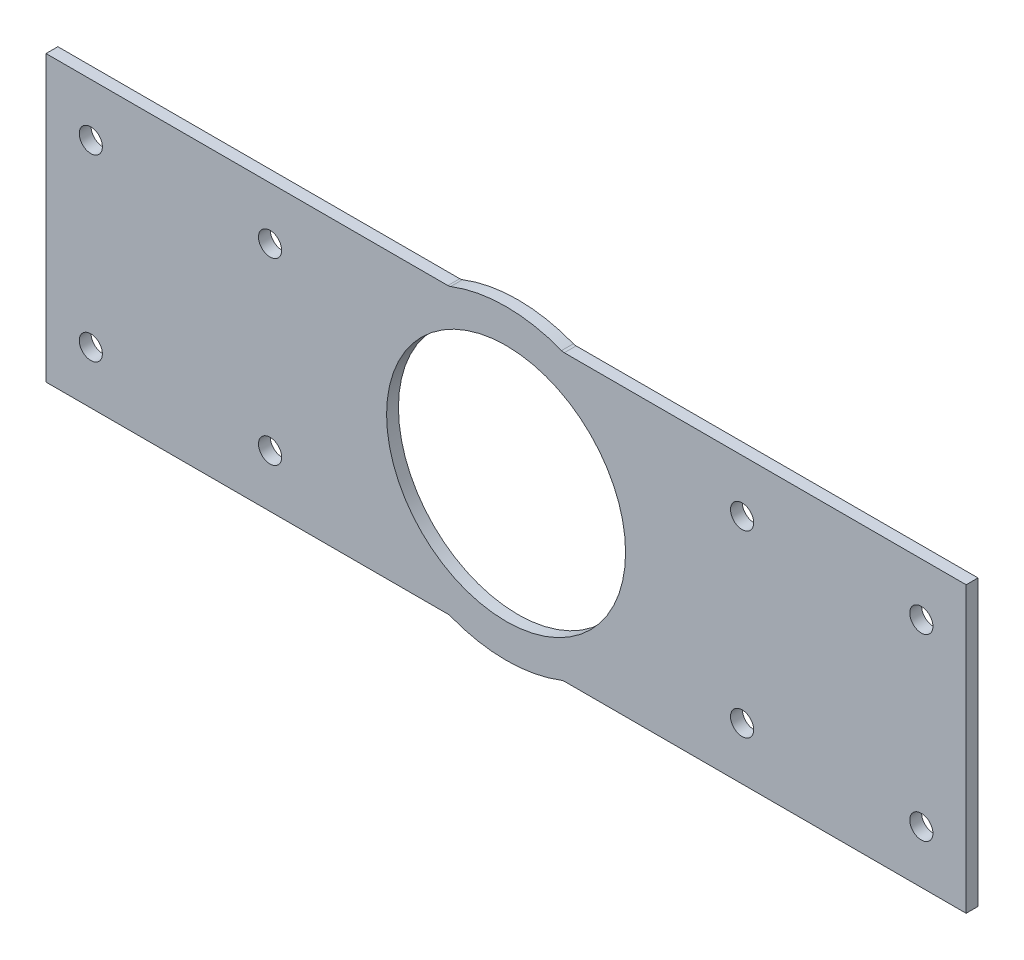
ISO-10303-21;
HEADER;
FILE_DESCRIPTION(('STEP AP214'),'2;1');
FILE_NAME('part.step','',(''),(''),'','','');
FILE_SCHEMA(('AUTOMOTIVE_DESIGN { 1 0 10303 214 1 1 1 1 }'));
ENDSEC;
DATA;
#1=APPLICATION_CONTEXT('core data for automotive mechanical design processes');
#2=APPLICATION_PROTOCOL_DEFINITION('international standard','automotive_design',2000,#1);
#3=PRODUCT_CONTEXT('',#1,'mechanical');
#4=PRODUCT('Part','Part','',(#3));
#5=PRODUCT_RELATED_PRODUCT_CATEGORY('part','',(#4));
#6=PRODUCT_DEFINITION_FORMATION('','',#4);
#7=PRODUCT_DEFINITION_CONTEXT('part definition',#1,'design');
#8=PRODUCT_DEFINITION('design','',#6,#7);
#9=PRODUCT_DEFINITION_SHAPE('','',#8);
#10=(LENGTH_UNIT() NAMED_UNIT(*) SI_UNIT(.MILLI.,.METRE.));
#11=(NAMED_UNIT(*) PLANE_ANGLE_UNIT() SI_UNIT($,.RADIAN.));
#12=(NAMED_UNIT(*) SI_UNIT($,.STERADIAN.) SOLID_ANGLE_UNIT());
#13=UNCERTAINTY_MEASURE_WITH_UNIT(LENGTH_MEASURE(1.E-05),#10,'distance_accuracy_value','');
#14=(GEOMETRIC_REPRESENTATION_CONTEXT(3) GLOBAL_UNCERTAINTY_ASSIGNED_CONTEXT((#13)) GLOBAL_UNIT_ASSIGNED_CONTEXT((#10,
#11,#12)) REPRESENTATION_CONTEXT('',''));
#15=CARTESIAN_POINT('',(0.,0.,0.));
#16=DIRECTION('',(0.,0.,1.));
#17=DIRECTION('',(1.,0.,0.));
#18=AXIS2_PLACEMENT_3D('',#15,#16,#17);
#19=CARTESIAN_POINT('',(0.,0.,1.5875));
#20=DIRECTION('',(0.,0.,-1.));
#21=DIRECTION('',(-1.,0.,0.));
#22=AXIS2_PLACEMENT_3D('',#19,#20,#21);
#23=PLANE('',#22);
#24=CARTESIAN_POINT('',(0.,0.,1.5875));
#25=DIRECTION('',(0.,0.,1.));
#26=DIRECTION('',(1.,0.,0.));
#27=AXIS2_PLACEMENT_3D('',#24,#25,#26);
#28=CIRCLE('',#27,32.);
#29=CARTESIAN_POINT('',(32.,0.,1.5875));
#30=VERTEX_POINT('',#29);
#31=EDGE_CURVE('E607',#30,#30,#28,.T.);
#32=ORIENTED_EDGE('',*,*,#31,.F.);
#33=EDGE_LOOP('',(#32));
#34=FACE_BOUND('',#33,.T.);
#35=CARTESIAN_POINT('',(63.2023827408732,24.,1.5875));
#36=DIRECTION('',(0.,0.,-1.));
#37=DIRECTION('',(-1.,0.,0.));
#38=AXIS2_PLACEMENT_3D('',#35,#36,#37);
#39=CIRCLE('',#38,3.09999999999999);
#40=CARTESIAN_POINT('',(60.1023827408732,24.,1.5875));
#41=VERTEX_POINT('',#40);
#42=EDGE_CURVE('E600',#41,#41,#39,.T.);
#43=ORIENTED_EDGE('',*,*,#42,.T.);
#44=EDGE_LOOP('',(#43));
#45=FACE_BOUND('',#44,.T.);
#46=CARTESIAN_POINT('',(111.202382740873,24.,1.5875));
#47=DIRECTION('',(0.,0.,1.));
#48=DIRECTION('',(1.,0.,0.));
#49=AXIS2_PLACEMENT_3D('',#46,#47,#48);
#50=CIRCLE('',#49,3.1);
#51=CARTESIAN_POINT('',(114.302382740873,24.,1.5875));
#52=VERTEX_POINT('',#51);
#53=EDGE_CURVE('E572',#52,#52,#50,.F.);
#54=ORIENTED_EDGE('',*,*,#53,.T.);
#55=EDGE_LOOP('',(#54));
#56=FACE_BOUND('',#55,.T.);
#57=CARTESIAN_POINT('',(111.202382740873,-24.,1.5875));
#58=DIRECTION('',(0.,0.,1.));
#59=DIRECTION('',(1.,0.,0.));
#60=AXIS2_PLACEMENT_3D('',#57,#58,#59);
#61=CIRCLE('',#60,3.1);
#62=CARTESIAN_POINT('',(114.302382740873,-24.,1.5875));
#63=VERTEX_POINT('',#62);
#64=EDGE_CURVE('E566',#63,#63,#61,.F.);
#65=ORIENTED_EDGE('',*,*,#64,.T.);
#66=EDGE_LOOP('',(#65));
#67=FACE_BOUND('',#66,.T.);
#68=CARTESIAN_POINT('',(63.2023827408733,-24.,1.5875));
#69=DIRECTION('',(0.,0.,1.));
#70=DIRECTION('',(1.,0.,0.));
#71=AXIS2_PLACEMENT_3D('',#68,#69,#70);
#72=CIRCLE('',#71,3.1);
#73=CARTESIAN_POINT('',(66.3023827408733,-24.,1.5875));
#74=VERTEX_POINT('',#73);
#75=EDGE_CURVE('E559',#74,#74,#72,.F.);
#76=ORIENTED_EDGE('',*,*,#75,.T.);
#77=EDGE_LOOP('',(#76));
#78=FACE_BOUND('',#77,.T.);
#79=CARTESIAN_POINT('',(0.,0.,1.5875));
#80=DIRECTION('',(0.,0.,-1.));
#81=DIRECTION('',(-1.,0.,0.));
#82=AXIS2_PLACEMENT_3D('',#79,#80,#81);
#83=CIRCLE('',#82,41.021);
#84=CARTESIAN_POINT('',(-14.8575397339142,38.2357941470445,1.5875));
#85=VERTEX_POINT('',#84);
#86=CARTESIAN_POINT('',(14.8575397339142,38.2357941470445,1.5875));
#87=VERTEX_POINT('',#86);
#88=EDGE_CURVE('E132',#85,#87,#83,.T.);
#89=ORIENTED_EDGE('',*,*,#88,.F.);
#90=CARTESIAN_POINT('',(-15.5819267422229,40.1,1.5875));
#91=DIRECTION('',(0.,0.,-1.));
#92=DIRECTION('',(-1.,0.,0.));
#93=AXIS2_PLACEMENT_3D('',#90,#91,#92);
#94=CIRCLE('',#93,2.);
#95=CARTESIAN_POINT('',(-15.5819267422229,38.1,1.5875));
#96=VERTEX_POINT('',#95);
#97=EDGE_CURVE('E216',#85,#96,#94,.T.);
#98=ORIENTED_EDGE('',*,*,#97,.T.);
#99=DIRECTION('',(-1.,0.,0.));
#100=VECTOR('',#99,1.);
#101=CARTESIAN_POINT('',(-15.2023827408732,38.1,1.5875));
#102=LINE('',#101,#100);
#103=CARTESIAN_POINT('',(-123.202382740873,38.1,1.5875));
#104=VERTEX_POINT('',#103);
#105=EDGE_CURVE('E142',#96,#104,#102,.T.);
#106=ORIENTED_EDGE('',*,*,#105,.T.);
#107=DIRECTION('',(0.,-1.,0.));
#108=VECTOR('',#107,1.);
#109=CARTESIAN_POINT('',(-123.202382740873,38.1,1.5875));
#110=LINE('',#109,#108);
#111=CARTESIAN_POINT('',(-123.202382740873,-38.1,1.5875));
#112=VERTEX_POINT('',#111);
#113=EDGE_CURVE('E158',#104,#112,#110,.T.);
#114=ORIENTED_EDGE('',*,*,#113,.T.);
#115=DIRECTION('',(-1.,0.,0.));
#116=VECTOR('',#115,1.);
#117=CARTESIAN_POINT('',(-15.2023827408732,-38.1,1.5875));
#118=LINE('',#117,#116);
#119=CARTESIAN_POINT('',(-15.5819267422229,-38.1,1.5875));
#120=VERTEX_POINT('',#119);
#121=EDGE_CURVE('E156',#120,#112,#118,.T.);
#122=ORIENTED_EDGE('',*,*,#121,.F.);
#123=CARTESIAN_POINT('',(-15.5819267422229,-40.1,1.5875));
#124=DIRECTION('',(0.,0.,-1.));
#125=DIRECTION('',(-1.,0.,0.));
#126=AXIS2_PLACEMENT_3D('',#123,#124,#125);
#127=CIRCLE('',#126,2.);
#128=CARTESIAN_POINT('',(-14.8575397339142,-38.2357941470445,1.5875));
#129=VERTEX_POINT('',#128);
#130=EDGE_CURVE('E208',#120,#129,#127,.T.);
#131=ORIENTED_EDGE('',*,*,#130,.T.);
#132=CARTESIAN_POINT('',(0.,0.,1.5875));
#133=DIRECTION('',(0.,0.,1.));
#134=DIRECTION('',(1.,0.,0.));
#135=AXIS2_PLACEMENT_3D('',#132,#133,#134);
#136=CIRCLE('',#135,41.021);
#137=CARTESIAN_POINT('',(14.8575397339142,-38.2357941470445,1.5875));
#138=VERTEX_POINT('',#137);
#139=EDGE_CURVE('E147',#129,#138,#136,.T.);
#140=ORIENTED_EDGE('',*,*,#139,.T.);
#141=CARTESIAN_POINT('',(15.5819267422229,-40.1,1.5875));
#142=DIRECTION('',(0.,0.,-1.));
#143=DIRECTION('',(-1.,0.,0.));
#144=AXIS2_PLACEMENT_3D('',#141,#142,#143);
#145=CIRCLE('',#144,2.);
#146=CARTESIAN_POINT('',(15.5819267422229,-38.1,1.5875));
#147=VERTEX_POINT('',#146);
#148=EDGE_CURVE('E215',#138,#147,#145,.T.);
#149=ORIENTED_EDGE('',*,*,#148,.T.);
#150=DIRECTION('',(1.,0.,0.));
#151=VECTOR('',#150,1.);
#152=CARTESIAN_POINT('',(15.2023827408732,-38.1,1.5875));
#153=LINE('',#152,#151);
#154=CARTESIAN_POINT('',(123.202382740873,-38.1,1.5875));
#155=VERTEX_POINT('',#154);
#156=EDGE_CURVE('E150',#147,#155,#153,.T.);
#157=ORIENTED_EDGE('',*,*,#156,.T.);
#158=DIRECTION('',(0.,-1.,0.));
#159=VECTOR('',#158,1.);
#160=CARTESIAN_POINT('',(123.202382740873,38.1,1.5875));
#161=LINE('',#160,#159);
#162=CARTESIAN_POINT('',(123.202382740873,38.1,1.5875));
#163=VERTEX_POINT('',#162);
#164=EDGE_CURVE('E135',#163,#155,#161,.T.);
#165=ORIENTED_EDGE('',*,*,#164,.F.);
#166=DIRECTION('',(1.,0.,0.));
#167=VECTOR('',#166,1.);
#168=CARTESIAN_POINT('',(15.2023827408732,38.1,1.5875));
#169=LINE('',#168,#167);
#170=CARTESIAN_POINT('',(15.5819267422229,38.1,1.5875));
#171=VERTEX_POINT('',#170);
#172=EDGE_CURVE('E124',#171,#163,#169,.T.);
#173=ORIENTED_EDGE('',*,*,#172,.F.);
#174=CARTESIAN_POINT('',(15.5819267422229,40.1,1.5875));
#175=DIRECTION('',(0.,0.,-1.));
#176=DIRECTION('',(-1.,0.,0.));
#177=AXIS2_PLACEMENT_3D('',#174,#175,#176);
#178=CIRCLE('',#177,2.);
#179=EDGE_CURVE('E11',#171,#87,#178,.T.);
#180=ORIENTED_EDGE('',*,*,#179,.T.);
#181=EDGE_LOOP('',(#89,#98,#106,#114,#122,#131,#140,#149,#157,#165,#173,#180));
#182=FACE_BOUND('',#181,.T.);
#183=CARTESIAN_POINT('',(-63.2023827408732,24.,1.5875));
#184=DIRECTION('',(0.,0.,1.));
#185=DIRECTION('',(1.,0.,0.));
#186=AXIS2_PLACEMENT_3D('',#183,#184,#185);
#187=CIRCLE('',#186,3.09999999999999);
#188=CARTESIAN_POINT('',(-60.1023827408732,24.,1.5875));
#189=VERTEX_POINT('',#188);
#190=EDGE_CURVE('E164',#189,#189,#187,.T.);
#191=ORIENTED_EDGE('',*,*,#190,.F.);
#192=EDGE_LOOP('',(#191));
#193=FACE_BOUND('',#192,.T.);
#194=CARTESIAN_POINT('',(-63.2023827408733,-24.,1.5875));
#195=DIRECTION('',(0.,0.,1.));
#196=DIRECTION('',(1.,0.,0.));
#197=AXIS2_PLACEMENT_3D('',#194,#195,#196);
#198=CIRCLE('',#197,3.1);
#199=CARTESIAN_POINT('',(-60.1023827408732,-24.,1.5875));
#200=VERTEX_POINT('',#199);
#201=EDGE_CURVE('E579',#200,#200,#198,.T.);
#202=ORIENTED_EDGE('',*,*,#201,.F.);
#203=EDGE_LOOP('',(#202));
#204=FACE_BOUND('',#203,.T.);
#205=CARTESIAN_POINT('',(-111.202382740873,-24.,1.5875));
#206=DIRECTION('',(0.,0.,1.));
#207=DIRECTION('',(1.,0.,0.));
#208=AXIS2_PLACEMENT_3D('',#205,#206,#207);
#209=CIRCLE('',#208,3.1);
#210=CARTESIAN_POINT('',(-108.102382740873,-24.,1.5875));
#211=VERTEX_POINT('',#210);
#212=EDGE_CURVE('E584',#211,#211,#209,.T.);
#213=ORIENTED_EDGE('',*,*,#212,.F.);
#214=EDGE_LOOP('',(#213));
#215=FACE_BOUND('',#214,.T.);
#216=CARTESIAN_POINT('',(-111.202382740873,24.,1.5875));
#217=DIRECTION('',(0.,0.,1.));
#218=DIRECTION('',(1.,0.,0.));
#219=AXIS2_PLACEMENT_3D('',#216,#217,#218);
#220=CIRCLE('',#219,3.1);
#221=CARTESIAN_POINT('',(-108.102382740873,24.,1.5875));
#222=VERTEX_POINT('',#221);
#223=EDGE_CURVE('E591',#222,#222,#220,.T.);
#224=ORIENTED_EDGE('',*,*,#223,.F.);
#225=EDGE_LOOP('',(#224));
#226=FACE_BOUND('',#225,.T.);
#227=ADVANCED_FACE('F39',(#34,#45,#56,#67,#78,#182,#193,#204,#215,#226),#23,.F.);
#228=CARTESIAN_POINT('',(0.,0.,-1.5875));
#229=DIRECTION('',(0.,0.,-1.));
#230=DIRECTION('',(-1.,0.,0.));
#231=AXIS2_PLACEMENT_3D('',#228,#229,#230);
#232=PLANE('',#231);
#233=CARTESIAN_POINT('',(0.,0.,-1.5875));
#234=DIRECTION('',(0.,0.,1.));
#235=DIRECTION('',(1.,0.,0.));
#236=AXIS2_PLACEMENT_3D('',#233,#234,#235);
#237=CIRCLE('',#236,32.);
#238=CARTESIAN_POINT('',(32.,0.,-1.5875));
#239=VERTEX_POINT('',#238);
#240=EDGE_CURVE('E602',#239,#239,#237,.T.);
#241=ORIENTED_EDGE('',*,*,#240,.T.);
#242=EDGE_LOOP('',(#241));
#243=FACE_BOUND('',#242,.T.);
#244=CARTESIAN_POINT('',(63.2023827408732,24.,-1.5875));
#245=DIRECTION('',(0.,0.,-1.));
#246=DIRECTION('',(-1.,0.,0.));
#247=AXIS2_PLACEMENT_3D('',#244,#245,#246);
#248=CIRCLE('',#247,3.09999999999999);
#249=CARTESIAN_POINT('',(60.1023827408732,24.,-1.5875));
#250=VERTEX_POINT('',#249);
#251=EDGE_CURVE('E599',#250,#250,#248,.T.);
#252=ORIENTED_EDGE('',*,*,#251,.F.);
#253=EDGE_LOOP('',(#252));
#254=FACE_BOUND('',#253,.T.);
#255=CARTESIAN_POINT('',(-111.202382740873,-24.,-1.5875));
#256=DIRECTION('',(0.,0.,1.));
#257=DIRECTION('',(1.,0.,0.));
#258=AXIS2_PLACEMENT_3D('',#255,#256,#257);
#259=CIRCLE('',#258,3.1);
#260=CARTESIAN_POINT('',(-108.102382740873,-24.,-1.5875));
#261=VERTEX_POINT('',#260);
#262=EDGE_CURVE('E586',#261,#261,#259,.T.);
#263=ORIENTED_EDGE('',*,*,#262,.T.);
#264=EDGE_LOOP('',(#263));
#265=FACE_BOUND('',#264,.T.);
#266=CARTESIAN_POINT('',(-63.2023827408733,-24.,-1.5875));
#267=DIRECTION('',(0.,0.,1.));
#268=DIRECTION('',(1.,0.,0.));
#269=AXIS2_PLACEMENT_3D('',#266,#267,#268);
#270=CIRCLE('',#269,3.1);
#271=CARTESIAN_POINT('',(-60.1023827408732,-24.,-1.5875));
#272=VERTEX_POINT('',#271);
#273=EDGE_CURVE('E582',#272,#272,#270,.T.);
#274=ORIENTED_EDGE('',*,*,#273,.T.);
#275=EDGE_LOOP('',(#274));
#276=FACE_BOUND('',#275,.T.);
#277=CARTESIAN_POINT('',(111.202382740873,24.,-1.5875));
#278=DIRECTION('',(0.,0.,1.));
#279=DIRECTION('',(1.,0.,0.));
#280=AXIS2_PLACEMENT_3D('',#277,#278,#279);
#281=CIRCLE('',#280,3.1);
#282=CARTESIAN_POINT('',(114.302382740873,24.,-1.5875));
#283=VERTEX_POINT('',#282);
#284=EDGE_CURVE('E577',#283,#283,#281,.F.);
#285=ORIENTED_EDGE('',*,*,#284,.F.);
#286=EDGE_LOOP('',(#285));
#287=FACE_BOUND('',#286,.T.);
#288=CARTESIAN_POINT('',(111.202382740873,-24.,-1.5875));
#289=DIRECTION('',(0.,0.,1.));
#290=DIRECTION('',(1.,0.,0.));
#291=AXIS2_PLACEMENT_3D('',#288,#289,#290);
#292=CIRCLE('',#291,3.1);
#293=CARTESIAN_POINT('',(114.302382740873,-24.,-1.5875));
#294=VERTEX_POINT('',#293);
#295=EDGE_CURVE('E568',#294,#294,#292,.F.);
#296=ORIENTED_EDGE('',*,*,#295,.F.);
#297=EDGE_LOOP('',(#296));
#298=FACE_BOUND('',#297,.T.);
#299=CARTESIAN_POINT('',(63.2023827408733,-24.,-1.5875));
#300=DIRECTION('',(0.,0.,1.));
#301=DIRECTION('',(1.,0.,0.));
#302=AXIS2_PLACEMENT_3D('',#299,#300,#301);
#303=CIRCLE('',#302,3.1);
#304=CARTESIAN_POINT('',(66.3023827408733,-24.,-1.5875));
#305=VERTEX_POINT('',#304);
#306=EDGE_CURVE('E564',#305,#305,#303,.F.);
#307=ORIENTED_EDGE('',*,*,#306,.F.);
#308=EDGE_LOOP('',(#307));
#309=FACE_BOUND('',#308,.T.);
#310=DIRECTION('',(-1.,0.,0.));
#311=VECTOR('',#310,1.);
#312=CARTESIAN_POINT('',(-15.2023827408732,38.1,-1.5875));
#313=LINE('',#312,#311);
#314=CARTESIAN_POINT('',(-15.5819267422229,38.1,-1.5875));
#315=VERTEX_POINT('',#314);
#316=CARTESIAN_POINT('',(-123.202382740873,38.1,-1.5875));
#317=VERTEX_POINT('',#316);
#318=EDGE_CURVE('E178',#315,#317,#313,.T.);
#319=ORIENTED_EDGE('',*,*,#318,.F.);
#320=CARTESIAN_POINT('',(-15.5819267422229,40.1,-1.5875));
#321=DIRECTION('',(0.,0.,-1.));
#322=DIRECTION('',(-1.,0.,0.));
#323=AXIS2_PLACEMENT_3D('',#320,#321,#322);
#324=CIRCLE('',#323,2.);
#325=CARTESIAN_POINT('',(-14.8575397339142,38.2357941470445,-1.5875));
#326=VERTEX_POINT('',#325);
#327=EDGE_CURVE('E212',#315,#326,#324,.F.);
#328=ORIENTED_EDGE('',*,*,#327,.T.);
#329=CARTESIAN_POINT('',(0.,0.,-1.5875));
#330=DIRECTION('',(0.,0.,-1.));
#331=DIRECTION('',(-1.,0.,0.));
#332=AXIS2_PLACEMENT_3D('',#329,#330,#331);
#333=CIRCLE('',#332,41.021);
#334=CARTESIAN_POINT('',(14.8575397339142,38.2357941470445,-1.5875));
#335=VERTEX_POINT('',#334);
#336=EDGE_CURVE('E165',#326,#335,#333,.T.);
#337=ORIENTED_EDGE('',*,*,#336,.T.);
#338=CARTESIAN_POINT('',(15.5819267422229,40.1,-1.5875));
#339=DIRECTION('',(0.,0.,-1.));
#340=DIRECTION('',(-1.,0.,0.));
#341=AXIS2_PLACEMENT_3D('',#338,#339,#340);
#342=CIRCLE('',#341,2.);
#343=CARTESIAN_POINT('',(15.5819267422229,38.1,-1.5875));
#344=VERTEX_POINT('',#343);
#345=EDGE_CURVE('E50',#335,#344,#342,.F.);
#346=ORIENTED_EDGE('',*,*,#345,.T.);
#347=DIRECTION('',(1.,0.,0.));
#348=VECTOR('',#347,1.);
#349=CARTESIAN_POINT('',(15.2023827408732,38.1,-1.5875));
#350=LINE('',#349,#348);
#351=CARTESIAN_POINT('',(123.202382740873,38.1,-1.5875));
#352=VERTEX_POINT('',#351);
#353=EDGE_CURVE('E163',#344,#352,#350,.T.);
#354=ORIENTED_EDGE('',*,*,#353,.T.);
#355=DIRECTION('',(0.,-1.,0.));
#356=VECTOR('',#355,1.);
#357=CARTESIAN_POINT('',(123.202382740873,38.1,-1.5875));
#358=LINE('',#357,#356);
#359=CARTESIAN_POINT('',(123.202382740873,-38.1,-1.5875));
#360=VERTEX_POINT('',#359);
#361=EDGE_CURVE('E136',#352,#360,#358,.T.);
#362=ORIENTED_EDGE('',*,*,#361,.T.);
#363=DIRECTION('',(1.,0.,0.));
#364=VECTOR('',#363,1.);
#365=CARTESIAN_POINT('',(15.2023827408732,-38.1,-1.5875));
#366=LINE('',#365,#364);
#367=CARTESIAN_POINT('',(15.5819267422229,-38.1,-1.5875));
#368=VERTEX_POINT('',#367);
#369=EDGE_CURVE('E169',#368,#360,#366,.T.);
#370=ORIENTED_EDGE('',*,*,#369,.F.);
#371=CARTESIAN_POINT('',(15.5819267422229,-40.1,-1.5875));
#372=DIRECTION('',(0.,0.,-1.));
#373=DIRECTION('',(-1.,0.,0.));
#374=AXIS2_PLACEMENT_3D('',#371,#372,#373);
#375=CIRCLE('',#374,2.);
#376=CARTESIAN_POINT('',(14.8575397339142,-38.2357941470445,-1.5875));
#377=VERTEX_POINT('',#376);
#378=EDGE_CURVE('E209',#368,#377,#375,.F.);
#379=ORIENTED_EDGE('',*,*,#378,.T.);
#380=CARTESIAN_POINT('',(0.,0.,-1.5875));
#381=DIRECTION('',(0.,0.,1.));
#382=DIRECTION('',(1.,0.,0.));
#383=AXIS2_PLACEMENT_3D('',#380,#381,#382);
#384=CIRCLE('',#383,41.021);
#385=CARTESIAN_POINT('',(-14.8575397339142,-38.2357941470445,-1.5875));
#386=VERTEX_POINT('',#385);
#387=EDGE_CURVE('E168',#386,#377,#384,.T.);
#388=ORIENTED_EDGE('',*,*,#387,.F.);
#389=CARTESIAN_POINT('',(-15.5819267422229,-40.1,-1.5875));
#390=DIRECTION('',(0.,0.,-1.));
#391=DIRECTION('',(-1.,0.,0.));
#392=AXIS2_PLACEMENT_3D('',#389,#390,#391);
#393=CIRCLE('',#392,2.);
#394=CARTESIAN_POINT('',(-15.5819267422229,-38.1,-1.5875));
#395=VERTEX_POINT('',#394);
#396=EDGE_CURVE('E206',#386,#395,#393,.F.);
#397=ORIENTED_EDGE('',*,*,#396,.T.);
#398=DIRECTION('',(-1.,0.,0.));
#399=VECTOR('',#398,1.);
#400=CARTESIAN_POINT('',(-15.2023827408732,-38.1,-1.5875));
#401=LINE('',#400,#399);
#402=CARTESIAN_POINT('',(-123.202382740873,-38.1,-1.5875));
#403=VERTEX_POINT('',#402);
#404=EDGE_CURVE('E172',#395,#403,#401,.T.);
#405=ORIENTED_EDGE('',*,*,#404,.T.);
#406=DIRECTION('',(0.,-1.,0.));
#407=VECTOR('',#406,1.);
#408=CARTESIAN_POINT('',(-123.202382740873,38.1,-1.5875));
#409=LINE('',#408,#407);
#410=EDGE_CURVE('E174',#317,#403,#409,.T.);
#411=ORIENTED_EDGE('',*,*,#410,.F.);
#412=EDGE_LOOP('',(#319,#328,#337,#346,#354,#362,#370,#379,#388,#397,#405,#411));
#413=FACE_BOUND('',#412,.T.);
#414=CARTESIAN_POINT('',(-63.2023827408732,24.,-1.5875));
#415=DIRECTION('',(0.,0.,1.));
#416=DIRECTION('',(1.,0.,0.));
#417=AXIS2_PLACEMENT_3D('',#414,#415,#416);
#418=CIRCLE('',#417,3.09999999999999);
#419=CARTESIAN_POINT('',(-60.1023827408732,24.,-1.5875));
#420=VERTEX_POINT('',#419);
#421=EDGE_CURVE('E558',#420,#420,#418,.T.);
#422=ORIENTED_EDGE('',*,*,#421,.T.);
#423=EDGE_LOOP('',(#422));
#424=FACE_BOUND('',#423,.T.);
#425=CARTESIAN_POINT('',(-111.202382740873,24.,-1.5875));
#426=DIRECTION('',(0.,0.,1.));
#427=DIRECTION('',(1.,0.,0.));
#428=AXIS2_PLACEMENT_3D('',#425,#426,#427);
#429=CIRCLE('',#428,3.1);
#430=CARTESIAN_POINT('',(-108.102382740873,24.,-1.5875));
#431=VERTEX_POINT('',#430);
#432=EDGE_CURVE('E592',#431,#431,#429,.T.);
#433=ORIENTED_EDGE('',*,*,#432,.T.);
#434=EDGE_LOOP('',(#433));
#435=FACE_BOUND('',#434,.T.);
#436=ADVANCED_FACE('F229',(#243,#254,#265,#276,#287,#298,#309,#413,#424,#435),#232,.T.);
#437=CARTESIAN_POINT('',(0.,0.,1.5875));
#438=DIRECTION('',(0.,0.,-1.));
#439=DIRECTION('',(-1.,0.,0.));
#440=AXIS2_PLACEMENT_3D('',#437,#438,#439);
#441=CYLINDRICAL_SURFACE('',#440,41.021);
#442=ORIENTED_EDGE('',*,*,#336,.F.);
#443=DIRECTION('',(0.,0.,-1.));
#444=VECTOR('',#443,1.);
#445=CARTESIAN_POINT('',(-14.8575397339142,38.2357941470445,1.5875));
#446=LINE('',#445,#444);
#447=EDGE_CURVE('E201',#326,#85,#446,.F.);
#448=ORIENTED_EDGE('',*,*,#447,.T.);
#449=ORIENTED_EDGE('',*,*,#88,.T.);
#450=DIRECTION('',(0.,0.,-1.));
#451=VECTOR('',#450,1.);
#452=CARTESIAN_POINT('',(14.8575397339142,38.2357941470445,1.5875));
#453=LINE('',#452,#451);
#454=EDGE_CURVE('E199',#87,#335,#453,.T.);
#455=ORIENTED_EDGE('',*,*,#454,.T.);
#456=EDGE_LOOP('',(#442,#448,#449,#455));
#457=FACE_BOUND('',#456,.T.);
#458=ADVANCED_FACE('F234',(#457),#441,.T.);
#459=CARTESIAN_POINT('',(-15.2023827408732,38.1,1.5875));
#460=DIRECTION('',(0.,-1.,0.));
#461=DIRECTION('',(0.,0.,-1.));
#462=AXIS2_PLACEMENT_3D('',#459,#460,#461);
#463=PLANE('',#462);
#464=ORIENTED_EDGE('',*,*,#105,.F.);
#465=DIRECTION('',(0.,0.,-1.));
#466=VECTOR('',#465,1.);
#467=CARTESIAN_POINT('',(-15.5819267422229,38.1,1.5875));
#468=LINE('',#467,#466);
#469=EDGE_CURVE('E197',#96,#315,#468,.T.);
#470=ORIENTED_EDGE('',*,*,#469,.T.);
#471=ORIENTED_EDGE('',*,*,#318,.T.);
#472=DIRECTION('',(0.,0.,-1.));
#473=VECTOR('',#472,1.);
#474=CARTESIAN_POINT('',(-123.202382740873,38.1,1.5875));
#475=LINE('',#474,#473);
#476=EDGE_CURVE('E176',#104,#317,#475,.T.);
#477=ORIENTED_EDGE('',*,*,#476,.F.);
#478=EDGE_LOOP('',(#464,#470,#471,#477));
#479=FACE_BOUND('',#478,.T.);
#480=ADVANCED_FACE('F223',(#479),#463,.F.);
#481=CARTESIAN_POINT('',(-123.202382740873,38.1,1.5875));
#482=DIRECTION('',(1.,0.,0.));
#483=DIRECTION('',(0.,0.,-1.));
#484=AXIS2_PLACEMENT_3D('',#481,#482,#483);
#485=PLANE('',#484);
#486=ORIENTED_EDGE('',*,*,#410,.T.);
#487=DIRECTION('',(0.,0.,-1.));
#488=VECTOR('',#487,1.);
#489=CARTESIAN_POINT('',(-123.202382740873,-38.1,1.5875));
#490=LINE('',#489,#488);
#491=EDGE_CURVE('E184',#112,#403,#490,.T.);
#492=ORIENTED_EDGE('',*,*,#491,.F.);
#493=ORIENTED_EDGE('',*,*,#113,.F.);
#494=ORIENTED_EDGE('',*,*,#476,.T.);
#495=EDGE_LOOP('',(#486,#492,#493,#494));
#496=FACE_BOUND('',#495,.T.);
#497=ADVANCED_FACE('F264',(#496),#485,.F.);
#498=CARTESIAN_POINT('',(-15.2023827408732,-38.1,1.5875));
#499=DIRECTION('',(0.,-1.,0.));
#500=DIRECTION('',(0.,0.,-1.));
#501=AXIS2_PLACEMENT_3D('',#498,#499,#500);
#502=PLANE('',#501);
#503=ORIENTED_EDGE('',*,*,#404,.F.);
#504=DIRECTION('',(0.,0.,-1.));
#505=VECTOR('',#504,1.);
#506=CARTESIAN_POINT('',(-15.5819267422229,-38.1,1.5875));
#507=LINE('',#506,#505);
#508=EDGE_CURVE('E195',#395,#120,#507,.F.);
#509=ORIENTED_EDGE('',*,*,#508,.T.);
#510=ORIENTED_EDGE('',*,*,#121,.T.);
#511=ORIENTED_EDGE('',*,*,#491,.T.);
#512=EDGE_LOOP('',(#503,#509,#510,#511));
#513=FACE_BOUND('',#512,.T.);
#514=ADVANCED_FACE('F268',(#513),#502,.T.);
#515=CARTESIAN_POINT('',(0.,0.,1.5875));
#516=DIRECTION('',(0.,0.,-1.));
#517=DIRECTION('',(-1.,0.,0.));
#518=AXIS2_PLACEMENT_3D('',#515,#516,#517);
#519=CYLINDRICAL_SURFACE('',#518,41.021);
#520=ORIENTED_EDGE('',*,*,#139,.F.);
#521=DIRECTION('',(0.,0.,-1.));
#522=VECTOR('',#521,1.);
#523=CARTESIAN_POINT('',(-14.8575397339142,-38.2357941470445,1.5875));
#524=LINE('',#523,#522);
#525=EDGE_CURVE('E188',#129,#386,#524,.T.);
#526=ORIENTED_EDGE('',*,*,#525,.T.);
#527=ORIENTED_EDGE('',*,*,#387,.T.);
#528=DIRECTION('',(0.,0.,-1.));
#529=VECTOR('',#528,1.);
#530=CARTESIAN_POINT('',(14.8575397339142,-38.2357941470445,1.5875));
#531=LINE('',#530,#529);
#532=EDGE_CURVE('E181',#377,#138,#531,.F.);
#533=ORIENTED_EDGE('',*,*,#532,.T.);
#534=EDGE_LOOP('',(#520,#526,#527,#533));
#535=FACE_BOUND('',#534,.T.);
#536=ADVANCED_FACE('F275',(#535),#519,.T.);
#537=CARTESIAN_POINT('',(15.2023827408732,-38.1,1.5875));
#538=DIRECTION('',(0.,1.,0.));
#539=DIRECTION('',(0.,0.,1.));
#540=AXIS2_PLACEMENT_3D('',#537,#538,#539);
#541=PLANE('',#540);
#542=ORIENTED_EDGE('',*,*,#156,.F.);
#543=DIRECTION('',(0.,0.,1.));
#544=VECTOR('',#543,1.);
#545=CARTESIAN_POINT('',(15.5819267422229,-38.1,-1.5875));
#546=LINE('',#545,#544);
#547=EDGE_CURVE('E194',#147,#368,#546,.F.);
#548=ORIENTED_EDGE('',*,*,#547,.T.);
#549=ORIENTED_EDGE('',*,*,#369,.T.);
#550=DIRECTION('',(0.,0.,-1.));
#551=VECTOR('',#550,1.);
#552=CARTESIAN_POINT('',(123.202382740873,-38.1,1.5875));
#553=LINE('',#552,#551);
#554=EDGE_CURVE('E143',#155,#360,#553,.T.);
#555=ORIENTED_EDGE('',*,*,#554,.F.);
#556=EDGE_LOOP('',(#542,#548,#549,#555));
#557=FACE_BOUND('',#556,.T.);
#558=ADVANCED_FACE('F277',(#557),#541,.F.);
#559=CARTESIAN_POINT('',(123.202382740873,38.1,1.5875));
#560=DIRECTION('',(1.,0.,0.));
#561=DIRECTION('',(0.,0.,-1.));
#562=AXIS2_PLACEMENT_3D('',#559,#560,#561);
#563=PLANE('',#562);
#564=ORIENTED_EDGE('',*,*,#361,.F.);
#565=DIRECTION('',(0.,0.,-1.));
#566=VECTOR('',#565,1.);
#567=CARTESIAN_POINT('',(123.202382740873,38.1,1.5875));
#568=LINE('',#567,#566);
#569=EDGE_CURVE('E130',#163,#352,#568,.T.);
#570=ORIENTED_EDGE('',*,*,#569,.F.);
#571=ORIENTED_EDGE('',*,*,#164,.T.);
#572=ORIENTED_EDGE('',*,*,#554,.T.);
#573=EDGE_LOOP('',(#564,#570,#571,#572));
#574=FACE_BOUND('',#573,.T.);
#575=ADVANCED_FACE('F140',(#574),#563,.T.);
#576=CARTESIAN_POINT('',(15.2023827408732,38.1,1.5875));
#577=DIRECTION('',(0.,1.,0.));
#578=DIRECTION('',(0.,0.,1.));
#579=AXIS2_PLACEMENT_3D('',#576,#577,#578);
#580=PLANE('',#579);
#581=ORIENTED_EDGE('',*,*,#353,.F.);
#582=DIRECTION('',(0.,0.,1.));
#583=VECTOR('',#582,1.);
#584=CARTESIAN_POINT('',(15.5819267422229,38.1,1.5875));
#585=LINE('',#584,#583);
#586=EDGE_CURVE('E53',#344,#171,#585,.T.);
#587=ORIENTED_EDGE('',*,*,#586,.T.);
#588=ORIENTED_EDGE('',*,*,#172,.T.);
#589=ORIENTED_EDGE('',*,*,#569,.T.);
#590=EDGE_LOOP('',(#581,#587,#588,#589));
#591=FACE_BOUND('',#590,.T.);
#592=ADVANCED_FACE('F127',(#591),#580,.T.);
#593=CARTESIAN_POINT('',(-63.2023827408732,24.,1.5875));
#594=DIRECTION('',(0.,0.,-1.));
#595=DIRECTION('',(-1.,0.,0.));
#596=AXIS2_PLACEMENT_3D('',#593,#594,#595);
#597=CYLINDRICAL_SURFACE('',#596,3.09999999999999);
#598=ORIENTED_EDGE('',*,*,#190,.T.);
#599=EDGE_LOOP('',(#598));
#600=FACE_BOUND('',#599,.T.);
#601=ORIENTED_EDGE('',*,*,#421,.F.);
#602=EDGE_LOOP('',(#601));
#603=FACE_BOUND('',#602,.T.);
#604=ADVANCED_FACE('F257',(#600,#603),#597,.F.);
#605=CARTESIAN_POINT('',(63.2023827408733,-24.,1.5875));
#606=DIRECTION('',(0.,0.,-1.));
#607=DIRECTION('',(-1.,0.,0.));
#608=AXIS2_PLACEMENT_3D('',#605,#606,#607);
#609=CYLINDRICAL_SURFACE('',#608,3.1);
#610=ORIENTED_EDGE('',*,*,#75,.F.);
#611=EDGE_LOOP('',(#610));
#612=FACE_BOUND('',#611,.T.);
#613=ORIENTED_EDGE('',*,*,#306,.T.);
#614=EDGE_LOOP('',(#613));
#615=FACE_BOUND('',#614,.T.);
#616=ADVANCED_FACE('F421',(#612,#615),#609,.F.);
#617=CARTESIAN_POINT('',(111.202382740873,-24.,1.5875));
#618=DIRECTION('',(0.,0.,-1.));
#619=DIRECTION('',(-1.,0.,0.));
#620=AXIS2_PLACEMENT_3D('',#617,#618,#619);
#621=CYLINDRICAL_SURFACE('',#620,3.1);
#622=ORIENTED_EDGE('',*,*,#64,.F.);
#623=EDGE_LOOP('',(#622));
#624=FACE_BOUND('',#623,.T.);
#625=ORIENTED_EDGE('',*,*,#295,.T.);
#626=EDGE_LOOP('',(#625));
#627=FACE_BOUND('',#626,.T.);
#628=ADVANCED_FACE('F411',(#624,#627),#621,.F.);
#629=CARTESIAN_POINT('',(111.202382740873,24.,1.5875));
#630=DIRECTION('',(0.,0.,-1.));
#631=DIRECTION('',(-1.,0.,0.));
#632=AXIS2_PLACEMENT_3D('',#629,#630,#631);
#633=CYLINDRICAL_SURFACE('',#632,3.1);
#634=ORIENTED_EDGE('',*,*,#53,.F.);
#635=EDGE_LOOP('',(#634));
#636=FACE_BOUND('',#635,.T.);
#637=ORIENTED_EDGE('',*,*,#284,.T.);
#638=EDGE_LOOP('',(#637));
#639=FACE_BOUND('',#638,.T.);
#640=ADVANCED_FACE('F410',(#636,#639),#633,.F.);
#641=CARTESIAN_POINT('',(-63.2023827408733,-24.,1.5875));
#642=DIRECTION('',(0.,0.,-1.));
#643=DIRECTION('',(-1.,0.,0.));
#644=AXIS2_PLACEMENT_3D('',#641,#642,#643);
#645=CYLINDRICAL_SURFACE('',#644,3.1);
#646=ORIENTED_EDGE('',*,*,#201,.T.);
#647=EDGE_LOOP('',(#646));
#648=FACE_BOUND('',#647,.T.);
#649=ORIENTED_EDGE('',*,*,#273,.F.);
#650=EDGE_LOOP('',(#649));
#651=FACE_BOUND('',#650,.T.);
#652=ADVANCED_FACE('F399',(#648,#651),#645,.F.);
#653=CARTESIAN_POINT('',(-111.202382740873,-24.,1.5875));
#654=DIRECTION('',(0.,0.,-1.));
#655=DIRECTION('',(-1.,0.,0.));
#656=AXIS2_PLACEMENT_3D('',#653,#654,#655);
#657=CYLINDRICAL_SURFACE('',#656,3.1);
#658=ORIENTED_EDGE('',*,*,#212,.T.);
#659=EDGE_LOOP('',(#658));
#660=FACE_BOUND('',#659,.T.);
#661=ORIENTED_EDGE('',*,*,#262,.F.);
#662=EDGE_LOOP('',(#661));
#663=FACE_BOUND('',#662,.T.);
#664=ADVANCED_FACE('F391',(#660,#663),#657,.F.);
#665=CARTESIAN_POINT('',(-111.202382740873,24.,1.5875));
#666=DIRECTION('',(0.,0.,-1.));
#667=DIRECTION('',(-1.,0.,0.));
#668=AXIS2_PLACEMENT_3D('',#665,#666,#667);
#669=CYLINDRICAL_SURFACE('',#668,3.1);
#670=ORIENTED_EDGE('',*,*,#223,.T.);
#671=EDGE_LOOP('',(#670));
#672=FACE_BOUND('',#671,.T.);
#673=ORIENTED_EDGE('',*,*,#432,.F.);
#674=EDGE_LOOP('',(#673));
#675=FACE_BOUND('',#674,.T.);
#676=ADVANCED_FACE('F382',(#672,#675),#669,.F.);
#677=CARTESIAN_POINT('',(63.2023827408732,24.,1.5875));
#678=DIRECTION('',(0.,0.,-1.));
#679=DIRECTION('',(-1.,0.,0.));
#680=AXIS2_PLACEMENT_3D('',#677,#678,#679);
#681=CYLINDRICAL_SURFACE('',#680,3.09999999999999);
#682=ORIENTED_EDGE('',*,*,#42,.F.);
#683=EDGE_LOOP('',(#682));
#684=FACE_BOUND('',#683,.T.);
#685=ORIENTED_EDGE('',*,*,#251,.T.);
#686=EDGE_LOOP('',(#685));
#687=FACE_BOUND('',#686,.T.);
#688=ADVANCED_FACE('F286',(#684,#687),#681,.F.);
#689=CARTESIAN_POINT('',(-15.5819267422229,-40.1,1.5875));
#690=DIRECTION('',(0.,0.,-1.));
#691=DIRECTION('',(-1.,0.,0.));
#692=AXIS2_PLACEMENT_3D('',#689,#690,#691);
#693=CYLINDRICAL_SURFACE('',#692,2.);
#694=ORIENTED_EDGE('',*,*,#130,.F.);
#695=ORIENTED_EDGE('',*,*,#508,.F.);
#696=ORIENTED_EDGE('',*,*,#396,.F.);
#697=ORIENTED_EDGE('',*,*,#525,.F.);
#698=EDGE_LOOP('',(#694,#695,#696,#697));
#699=FACE_BOUND('',#698,.T.);
#700=ADVANCED_FACE('F290',(#699),#693,.F.);
#701=CARTESIAN_POINT('',(15.5819267422229,-40.1,1.5875));
#702=DIRECTION('',(0.,0.,-1.));
#703=DIRECTION('',(-1.,0.,0.));
#704=AXIS2_PLACEMENT_3D('',#701,#702,#703);
#705=CYLINDRICAL_SURFACE('',#704,2.);
#706=ORIENTED_EDGE('',*,*,#148,.F.);
#707=ORIENTED_EDGE('',*,*,#532,.F.);
#708=ORIENTED_EDGE('',*,*,#378,.F.);
#709=ORIENTED_EDGE('',*,*,#547,.F.);
#710=EDGE_LOOP('',(#706,#707,#708,#709));
#711=FACE_BOUND('',#710,.T.);
#712=ADVANCED_FACE('F250',(#711),#705,.F.);
#713=CARTESIAN_POINT('',(-15.5819267422229,40.1,1.5875));
#714=DIRECTION('',(0.,0.,-1.));
#715=DIRECTION('',(-1.,0.,0.));
#716=AXIS2_PLACEMENT_3D('',#713,#714,#715);
#717=CYLINDRICAL_SURFACE('',#716,2.);
#718=ORIENTED_EDGE('',*,*,#97,.F.);
#719=ORIENTED_EDGE('',*,*,#447,.F.);
#720=ORIENTED_EDGE('',*,*,#327,.F.);
#721=ORIENTED_EDGE('',*,*,#469,.F.);
#722=EDGE_LOOP('',(#718,#719,#720,#721));
#723=FACE_BOUND('',#722,.T.);
#724=ADVANCED_FACE('F227',(#723),#717,.F.);
#725=CARTESIAN_POINT('',(15.5819267422229,40.1,1.5875));
#726=DIRECTION('',(0.,0.,-1.));
#727=DIRECTION('',(-1.,0.,0.));
#728=AXIS2_PLACEMENT_3D('',#725,#726,#727);
#729=CYLINDRICAL_SURFACE('',#728,2.);
#730=ORIENTED_EDGE('',*,*,#179,.F.);
#731=ORIENTED_EDGE('',*,*,#586,.F.);
#732=ORIENTED_EDGE('',*,*,#345,.F.);
#733=ORIENTED_EDGE('',*,*,#454,.F.);
#734=EDGE_LOOP('',(#730,#731,#732,#733));
#735=FACE_BOUND('',#734,.T.);
#736=ADVANCED_FACE('F41',(#735),#729,.F.);
#737=CARTESIAN_POINT('',(0.,0.,-1.5875));
#738=DIRECTION('',(0.,0.,1.));
#739=DIRECTION('',(1.,0.,0.));
#740=AXIS2_PLACEMENT_3D('',#737,#738,#739);
#741=CYLINDRICAL_SURFACE('',#740,32.);
#742=ORIENTED_EDGE('',*,*,#240,.F.);
#743=EDGE_LOOP('',(#742));
#744=FACE_BOUND('',#743,.T.);
#745=ORIENTED_EDGE('',*,*,#31,.T.);
#746=EDGE_LOOP('',(#745));
#747=FACE_BOUND('',#746,.T.);
#748=ADVANCED_FACE('F236',(#744,#747),#741,.F.);
#749=CLOSED_SHELL('',(#227,#436,#458,#480,#497,#514,#536,#558,#575,#592,#604,#616,#628,#640,
#652,#664,#676,#688,#700,#712,#724,#736,#748));
#750=MANIFOLD_SOLID_BREP('B2',#749);
#751=ADVANCED_BREP_SHAPE_REPRESENTATION('',(#18,#750),#14);
#752=SHAPE_DEFINITION_REPRESENTATION(#9,#751);
ENDSEC;
END-ISO-10303-21;
